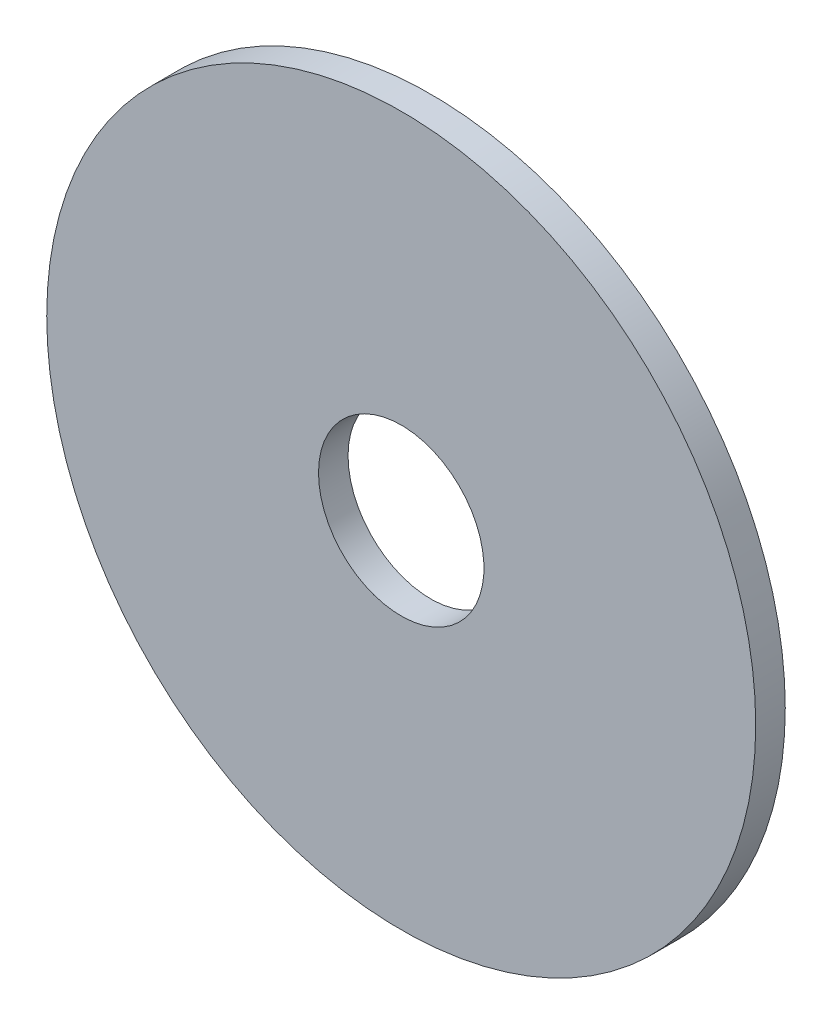
ISO-10303-21;
HEADER;
FILE_DESCRIPTION(('STEP AP214'),'2;1');
FILE_NAME('part.step','',(''),(''),'','','');
FILE_SCHEMA(('AUTOMOTIVE_DESIGN { 1 0 10303 214 1 1 1 1 }'));
ENDSEC;
DATA;
#1=APPLICATION_CONTEXT('core data for automotive mechanical design processes');
#2=APPLICATION_PROTOCOL_DEFINITION('international standard','automotive_design',2000,#1);
#3=PRODUCT_CONTEXT('',#1,'mechanical');
#4=PRODUCT('Part','Part','',(#3));
#5=PRODUCT_RELATED_PRODUCT_CATEGORY('part','',(#4));
#6=PRODUCT_DEFINITION_FORMATION('','',#4);
#7=PRODUCT_DEFINITION_CONTEXT('part definition',#1,'design');
#8=PRODUCT_DEFINITION('design','',#6,#7);
#9=PRODUCT_DEFINITION_SHAPE('','',#8);
#10=(LENGTH_UNIT() NAMED_UNIT(*) SI_UNIT(.MILLI.,.METRE.));
#11=(NAMED_UNIT(*) PLANE_ANGLE_UNIT() SI_UNIT($,.RADIAN.));
#12=(NAMED_UNIT(*) SI_UNIT($,.STERADIAN.) SOLID_ANGLE_UNIT());
#13=UNCERTAINTY_MEASURE_WITH_UNIT(LENGTH_MEASURE(1.E-05),#10,'distance_accuracy_value','');
#14=(GEOMETRIC_REPRESENTATION_CONTEXT(3) GLOBAL_UNCERTAINTY_ASSIGNED_CONTEXT((#13)) GLOBAL_UNIT_ASSIGNED_CONTEXT((#10,
#11,#12)) REPRESENTATION_CONTEXT('',''));
#15=CARTESIAN_POINT('',(0.,0.,0.));
#16=DIRECTION('',(0.,0.,1.));
#17=DIRECTION('',(1.,0.,0.));
#18=AXIS2_PLACEMENT_3D('',#15,#16,#17);
#19=CARTESIAN_POINT('',(4.2,0.,0.));
#20=DIRECTION('',(0.,0.,-1.));
#21=DIRECTION('',(-1.,0.,0.));
#22=AXIS2_PLACEMENT_3D('',#19,#20,#21);
#23=PLANE('',#22);
#24=CARTESIAN_POINT('',(0.,0.,0.));
#25=DIRECTION('',(0.,0.,-1.));
#26=DIRECTION('',(-1.,0.,0.));
#27=AXIS2_PLACEMENT_3D('',#24,#25,#26);
#28=CIRCLE('',#27,18.);
#29=CARTESIAN_POINT('',(-18.,0.,0.));
#30=VERTEX_POINT('',#29);
#31=EDGE_CURVE('E10',#30,#30,#28,.T.);
#32=ORIENTED_EDGE('',*,*,#31,.T.);
#33=EDGE_LOOP('',(#32));
#34=FACE_BOUND('',#33,.T.);
#35=CARTESIAN_POINT('',(0.,0.,0.));
#36=DIRECTION('',(0.,0.,-1.));
#37=DIRECTION('',(-1.,0.,0.));
#38=AXIS2_PLACEMENT_3D('',#35,#36,#37);
#39=CIRCLE('',#38,4.2);
#40=CARTESIAN_POINT('',(-4.2,0.,0.));
#41=VERTEX_POINT('',#40);
#42=EDGE_CURVE('E42',#41,#41,#39,.T.);
#43=ORIENTED_EDGE('',*,*,#42,.F.);
#44=EDGE_LOOP('',(#43));
#45=FACE_BOUND('',#44,.T.);
#46=ADVANCED_FACE('F28',(#34,#45),#23,.T.);
#47=CARTESIAN_POINT('',(0.,0.,1.5));
#48=DIRECTION('',(0.,0.,-1.));
#49=DIRECTION('',(-1.,0.,0.));
#50=AXIS2_PLACEMENT_3D('',#47,#48,#49);
#51=CYLINDRICAL_SURFACE('',#50,18.);
#52=CARTESIAN_POINT('',(0.,0.,1.5));
#53=DIRECTION('',(0.,0.,-1.));
#54=DIRECTION('',(-1.,0.,0.));
#55=AXIS2_PLACEMENT_3D('',#52,#53,#54);
#56=CIRCLE('',#55,18.);
#57=CARTESIAN_POINT('',(-18.,0.,1.5));
#58=VERTEX_POINT('',#57);
#59=EDGE_CURVE('E34',#58,#58,#56,.T.);
#60=ORIENTED_EDGE('',*,*,#59,.T.);
#61=EDGE_LOOP('',(#60));
#62=FACE_BOUND('',#61,.T.);
#63=ORIENTED_EDGE('',*,*,#31,.F.);
#64=EDGE_LOOP('',(#63));
#65=FACE_BOUND('',#64,.T.);
#66=ADVANCED_FACE('F52',(#62,#65),#51,.T.);
#67=CARTESIAN_POINT('',(18.,0.,1.5));
#68=DIRECTION('',(0.,0.,1.));
#69=DIRECTION('',(1.,0.,0.));
#70=AXIS2_PLACEMENT_3D('',#67,#68,#69);
#71=PLANE('',#70);
#72=CARTESIAN_POINT('',(0.,0.,1.5));
#73=DIRECTION('',(0.,0.,-1.));
#74=DIRECTION('',(-1.,0.,0.));
#75=AXIS2_PLACEMENT_3D('',#72,#73,#74);
#76=CIRCLE('',#75,4.2);
#77=CARTESIAN_POINT('',(-4.2,0.,1.5));
#78=VERTEX_POINT('',#77);
#79=EDGE_CURVE('E38',#78,#78,#76,.T.);
#80=ORIENTED_EDGE('',*,*,#79,.T.);
#81=EDGE_LOOP('',(#80));
#82=FACE_BOUND('',#81,.T.);
#83=ORIENTED_EDGE('',*,*,#59,.F.);
#84=EDGE_LOOP('',(#83));
#85=FACE_BOUND('',#84,.T.);
#86=ADVANCED_FACE('F56',(#82,#85),#71,.T.);
#87=CARTESIAN_POINT('',(0.,0.,1.5));
#88=DIRECTION('',(0.,0.,-1.));
#89=DIRECTION('',(-1.,0.,0.));
#90=AXIS2_PLACEMENT_3D('',#87,#88,#89);
#91=CYLINDRICAL_SURFACE('',#90,4.2);
#92=ORIENTED_EDGE('',*,*,#42,.T.);
#93=EDGE_LOOP('',(#92));
#94=FACE_BOUND('',#93,.T.);
#95=ORIENTED_EDGE('',*,*,#79,.F.);
#96=EDGE_LOOP('',(#95));
#97=FACE_BOUND('',#96,.T.);
#98=ADVANCED_FACE('F48',(#94,#97),#91,.F.);
#99=CLOSED_SHELL('',(#46,#66,#86,#98));
#100=MANIFOLD_SOLID_BREP('B2',#99);
#101=ADVANCED_BREP_SHAPE_REPRESENTATION('',(#18,#100),#14);
#102=SHAPE_DEFINITION_REPRESENTATION(#9,#101);
ENDSEC;
END-ISO-10303-21;
